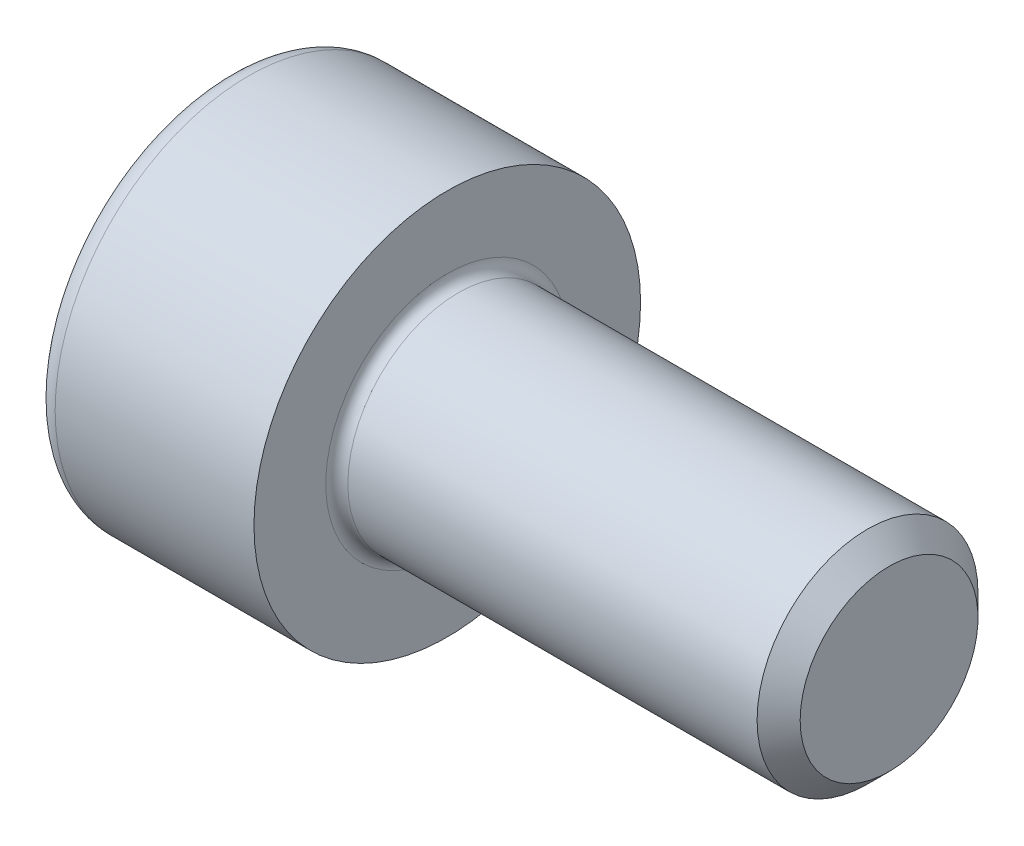
ISO-10303-21;
HEADER;
FILE_DESCRIPTION(('STEP AP214'),'2;1');
FILE_NAME('part.step','',(''),(''),'','','');
FILE_SCHEMA(('AUTOMOTIVE_DESIGN { 1 0 10303 214 1 1 1 1 }'));
ENDSEC;
DATA;
#1=APPLICATION_CONTEXT('core data for automotive mechanical design processes');
#2=APPLICATION_PROTOCOL_DEFINITION('international standard','automotive_design',2000,#1);
#3=PRODUCT_CONTEXT('',#1,'mechanical');
#4=PRODUCT('Part','Part','',(#3));
#5=PRODUCT_RELATED_PRODUCT_CATEGORY('part','',(#4));
#6=PRODUCT_DEFINITION_FORMATION('','',#4);
#7=PRODUCT_DEFINITION_CONTEXT('part definition',#1,'design');
#8=PRODUCT_DEFINITION('design','',#6,#7);
#9=PRODUCT_DEFINITION_SHAPE('','',#8);
#10=(LENGTH_UNIT() NAMED_UNIT(*) SI_UNIT(.MILLI.,.METRE.));
#11=(NAMED_UNIT(*) PLANE_ANGLE_UNIT() SI_UNIT($,.RADIAN.));
#12=(NAMED_UNIT(*) SI_UNIT($,.STERADIAN.) SOLID_ANGLE_UNIT());
#13=UNCERTAINTY_MEASURE_WITH_UNIT(LENGTH_MEASURE(1.E-05),#10,'distance_accuracy_value','');
#14=(GEOMETRIC_REPRESENTATION_CONTEXT(3) GLOBAL_UNCERTAINTY_ASSIGNED_CONTEXT((#13)) GLOBAL_UNIT_ASSIGNED_CONTEXT((#10,
#11,#12)) REPRESENTATION_CONTEXT('',''));
#15=CARTESIAN_POINT('',(0.,0.,0.));
#16=DIRECTION('',(0.,0.,1.));
#17=DIRECTION('',(1.,0.,0.));
#18=AXIS2_PLACEMENT_3D('',#15,#16,#17);
#19=CARTESIAN_POINT('',(0.,0.,0.));
#20=DIRECTION('',(-1.,0.,0.));
#21=DIRECTION('',(0.,0.,1.));
#22=AXIS2_PLACEMENT_3D('',#19,#20,#21);
#23=PLANE('',#22);
#24=DIRECTION('',(0.,-0.499999999999999,0.866025403784439));
#25=VECTOR('',#24,1.);
#26=CARTESIAN_POINT('',(0.,1.74359781295266,0.));
#27=LINE('',#26,#25);
#28=CARTESIAN_POINT('',(0.,1.74359781295266,0.));
#29=VERTEX_POINT('',#28);
#30=CARTESIAN_POINT('',(0.,0.871798906476331,1.51));
#31=VERTEX_POINT('',#30);
#32=EDGE_CURVE('E265',#29,#31,#27,.T.);
#33=ORIENTED_EDGE('',*,*,#32,.T.);
#34=DIRECTION('',(0.,1.,0.));
#35=VECTOR('',#34,1.);
#36=CARTESIAN_POINT('',(0.,-0.871798906476339,1.51));
#37=LINE('',#36,#35);
#38=CARTESIAN_POINT('',(0.,-0.871798906476339,1.51));
#39=VERTEX_POINT('',#38);
#40=EDGE_CURVE('E137',#39,#31,#37,.T.);
#41=ORIENTED_EDGE('',*,*,#40,.F.);
#42=DIRECTION('',(0.,-0.500000000000001,-0.866025403784438));
#43=VECTOR('',#42,1.);
#44=CARTESIAN_POINT('',(0.,-0.871798906476339,1.51));
#45=LINE('',#44,#43);
#46=CARTESIAN_POINT('',(0.,-1.74359781295268,0.));
#47=VERTEX_POINT('',#46);
#48=EDGE_CURVE('E268',#39,#47,#45,.T.);
#49=ORIENTED_EDGE('',*,*,#48,.T.);
#50=DIRECTION('',(0.,0.499999999999999,-0.866025403784439));
#51=VECTOR('',#50,1.);
#52=CARTESIAN_POINT('',(0.,-1.74359781295268,0.));
#53=LINE('',#52,#51);
#54=CARTESIAN_POINT('',(0.,-0.871798906476343,-1.51));
#55=VERTEX_POINT('',#54);
#56=EDGE_CURVE('E271',#47,#55,#53,.T.);
#57=ORIENTED_EDGE('',*,*,#56,.T.);
#58=DIRECTION('',(0.,-1.,0.));
#59=VECTOR('',#58,1.);
#60=CARTESIAN_POINT('',(0.,0.871798906476327,-1.51));
#61=LINE('',#60,#59);
#62=CARTESIAN_POINT('',(0.,0.871798906476327,-1.51));
#63=VERTEX_POINT('',#62);
#64=EDGE_CURVE('E274',#63,#55,#61,.T.);
#65=ORIENTED_EDGE('',*,*,#64,.F.);
#66=DIRECTION('',(0.,-0.500000000000001,-0.866025403784438));
#67=VECTOR('',#66,1.);
#68=CARTESIAN_POINT('',(0.,1.74359781295266,0.));
#69=LINE('',#68,#67);
#70=EDGE_CURVE('E132',#29,#63,#69,.T.);
#71=ORIENTED_EDGE('',*,*,#70,.F.);
#72=EDGE_LOOP('',(#33,#41,#49,#57,#65,#71));
#73=FACE_BOUND('',#72,.T.);
#74=CARTESIAN_POINT('',(0.,0.,0.));
#75=DIRECTION('',(-1.,0.,0.));
#76=DIRECTION('',(0.,0.,1.));
#77=AXIS2_PLACEMENT_3D('',#74,#75,#76);
#78=CIRCLE('',#77,3.1);
#79=CARTESIAN_POINT('',(0.,0.,3.1));
#80=VERTEX_POINT('',#79);
#81=EDGE_CURVE('E49',#80,#80,#78,.T.);
#82=ORIENTED_EDGE('',*,*,#81,.T.);
#83=EDGE_LOOP('',(#82));
#84=FACE_BOUND('',#83,.T.);
#85=ADVANCED_FACE('F41',(#73,#84),#23,.T.);
#86=CARTESIAN_POINT('',(-31.75,0.,0.));
#87=DIRECTION('',(-1.,0.,0.));
#88=DIRECTION('',(0.,0.,1.));
#89=AXIS2_PLACEMENT_3D('',#86,#87,#88);
#90=CYLINDRICAL_SURFACE('',#89,3.5);
#91=CARTESIAN_POINT('',(0.399999999999998,0.,0.));
#92=DIRECTION('',(-1.,0.,0.));
#93=DIRECTION('',(0.,0.,1.));
#94=AXIS2_PLACEMENT_3D('',#91,#92,#93);
#95=CIRCLE('',#94,3.5);
#96=CARTESIAN_POINT('',(0.399999999999998,0.,3.5));
#97=VERTEX_POINT('',#96);
#98=EDGE_CURVE('E11',#97,#97,#95,.F.);
#99=ORIENTED_EDGE('',*,*,#98,.T.);
#100=EDGE_LOOP('',(#99));
#101=FACE_BOUND('',#100,.T.);
#102=CARTESIAN_POINT('',(4.,0.,0.));
#103=DIRECTION('',(-1.,0.,0.));
#104=DIRECTION('',(0.,0.,1.));
#105=AXIS2_PLACEMENT_3D('',#102,#103,#104);
#106=CIRCLE('',#105,3.5);
#107=CARTESIAN_POINT('',(4.,0.,3.5));
#108=VERTEX_POINT('',#107);
#109=EDGE_CURVE('E155',#108,#108,#106,.T.);
#110=ORIENTED_EDGE('',*,*,#109,.T.);
#111=EDGE_LOOP('',(#110));
#112=FACE_BOUND('',#111,.T.);
#113=ADVANCED_FACE('F180',(#101,#112),#90,.T.);
#114=CARTESIAN_POINT('',(4.,3.5,0.));
#115=DIRECTION('',(1.,0.,0.));
#116=DIRECTION('',(0.,0.,-1.));
#117=AXIS2_PLACEMENT_3D('',#114,#115,#116);
#118=PLANE('',#117);
#119=CARTESIAN_POINT('',(4.,0.,0.));
#120=DIRECTION('',(1.,0.,0.));
#121=DIRECTION('',(0.,0.,-1.));
#122=AXIS2_PLACEMENT_3D('',#119,#120,#121);
#123=CIRCLE('',#122,2.19999999999981);
#124=CARTESIAN_POINT('',(4.,0.,-2.19999999999981));
#125=VERTEX_POINT('',#124);
#126=EDGE_CURVE('E158',#125,#125,#123,.F.);
#127=ORIENTED_EDGE('',*,*,#126,.T.);
#128=EDGE_LOOP('',(#127));
#129=FACE_BOUND('',#128,.T.);
#130=ORIENTED_EDGE('',*,*,#109,.F.);
#131=EDGE_LOOP('',(#130));
#132=FACE_BOUND('',#131,.T.);
#133=ADVANCED_FACE('F185',(#129,#132),#118,.T.);
#134=CARTESIAN_POINT('',(-31.75,0.,0.));
#135=DIRECTION('',(-1.,0.,0.));
#136=DIRECTION('',(0.,0.,1.));
#137=AXIS2_PLACEMENT_3D('',#134,#135,#136);
#138=CYLINDRICAL_SURFACE('',#137,1.99999999999981);
#139=CARTESIAN_POINT('',(4.2,0.,0.));
#140=DIRECTION('',(1.,0.,0.));
#141=DIRECTION('',(0.,0.,-1.));
#142=AXIS2_PLACEMENT_3D('',#139,#140,#141);
#143=CIRCLE('',#142,1.99999999999981);
#144=CARTESIAN_POINT('',(4.2,0.,-1.99999999999981));
#145=VERTEX_POINT('',#144);
#146=EDGE_CURVE('E161',#145,#145,#143,.T.);
#147=ORIENTED_EDGE('',*,*,#146,.T.);
#148=EDGE_LOOP('',(#147));
#149=FACE_BOUND('',#148,.T.);
#150=CARTESIAN_POINT('',(11.6099999999996,0.,0.));
#151=DIRECTION('',(-1.,0.,0.));
#152=DIRECTION('',(0.,0.,1.));
#153=AXIS2_PLACEMENT_3D('',#150,#151,#152);
#154=CIRCLE('',#153,1.99999999999963);
#155=CARTESIAN_POINT('',(11.6099999999996,0.,1.99999999999963));
#156=VERTEX_POINT('',#155);
#157=EDGE_CURVE('E152',#156,#156,#154,.T.);
#158=ORIENTED_EDGE('',*,*,#157,.T.);
#159=EDGE_LOOP('',(#158));
#160=FACE_BOUND('',#159,.T.);
#161=ADVANCED_FACE('F191',(#149,#160),#138,.T.);
#162=CARTESIAN_POINT('',(12.,0.,0.));
#163=DIRECTION('',(-1.,0.,0.));
#164=DIRECTION('',(0.,0.,1.));
#165=AXIS2_PLACEMENT_3D('',#162,#163,#164);
#166=CONICAL_SURFACE('',#165,1.61,0.785398163396504);
#167=ORIENTED_EDGE('',*,*,#157,.F.);
#168=EDGE_LOOP('',(#167));
#169=FACE_BOUND('',#168,.T.);
#170=CARTESIAN_POINT('',(12.,0.,0.));
#171=DIRECTION('',(-1.,0.,0.));
#172=DIRECTION('',(0.,0.,1.));
#173=AXIS2_PLACEMENT_3D('',#170,#171,#172);
#174=CIRCLE('',#173,1.61);
#175=CARTESIAN_POINT('',(12.,0.,1.61));
#176=VERTEX_POINT('',#175);
#177=EDGE_CURVE('E148',#176,#176,#174,.T.);
#178=ORIENTED_EDGE('',*,*,#177,.T.);
#179=EDGE_LOOP('',(#178));
#180=FACE_BOUND('',#179,.T.);
#181=ADVANCED_FACE('F195',(#169,#180),#166,.T.);
#182=CARTESIAN_POINT('',(12.,1.61,0.));
#183=DIRECTION('',(1.,0.,0.));
#184=DIRECTION('',(0.,0.,-1.));
#185=AXIS2_PLACEMENT_3D('',#182,#183,#184);
#186=PLANE('',#185);
#187=ORIENTED_EDGE('',*,*,#177,.F.);
#188=EDGE_LOOP('',(#187));
#189=FACE_BOUND('',#188,.T.);
#190=ADVANCED_FACE('F177',(#189),#186,.T.);
#191=CARTESIAN_POINT('',(4.2,0.,0.));
#192=DIRECTION('',(1.,0.,0.));
#193=DIRECTION('',(0.,0.,-1.));
#194=AXIS2_PLACEMENT_3D('',#191,#192,#193);
#195=TOROIDAL_SURFACE('',#194,2.19999999999981,0.2);
#196=ORIENTED_EDGE('',*,*,#146,.F.);
#197=EDGE_LOOP('',(#196));
#198=FACE_BOUND('',#197,.T.);
#199=ORIENTED_EDGE('',*,*,#126,.F.);
#200=EDGE_LOOP('',(#199));
#201=FACE_BOUND('',#200,.T.);
#202=ADVANCED_FACE('F168',(#198,#201),#195,.F.);
#203=CARTESIAN_POINT('',(0.399999999999998,0.,0.));
#204=DIRECTION('',(-1.,0.,0.));
#205=DIRECTION('',(0.,0.,1.));
#206=AXIS2_PLACEMENT_3D('',#203,#204,#205);
#207=TOROIDAL_SURFACE('',#206,3.1,0.4);
#208=ORIENTED_EDGE('',*,*,#98,.F.);
#209=EDGE_LOOP('',(#208));
#210=FACE_BOUND('',#209,.T.);
#211=ORIENTED_EDGE('',*,*,#81,.F.);
#212=EDGE_LOOP('',(#211));
#213=FACE_BOUND('',#212,.T.);
#214=ADVANCED_FACE('F43',(#210,#213),#207,.T.);
#215=CARTESIAN_POINT('',(2.,1.74359781295266,0.));
#216=DIRECTION('',(0.,-0.866025403784439,-0.499999999999999));
#217=DIRECTION('',(0.,0.499999999999999,-0.866025403784439));
#218=AXIS2_PLACEMENT_3D('',#215,#216,#217);
#219=PLANE('',#218);
#220=ORIENTED_EDGE('',*,*,#32,.F.);
#221=DIRECTION('',(-1.,0.,0.));
#222=VECTOR('',#221,1.);
#223=CARTESIAN_POINT('',(2.,1.74359781295266,0.));
#224=LINE('',#223,#222);
#225=CARTESIAN_POINT('',(2.,1.74359781295266,0.));
#226=VERTEX_POINT('',#225);
#227=EDGE_CURVE('E255',#226,#29,#224,.T.);
#228=ORIENTED_EDGE('',*,*,#227,.F.);
#229=DIRECTION('',(0.,-0.499999999999999,0.866025403784439));
#230=VECTOR('',#229,1.);
#231=CARTESIAN_POINT('',(2.,1.74359781295266,0.));
#232=LINE('',#231,#230);
#233=CARTESIAN_POINT('',(2.,1.3076983597145,0.754999999999996));
#234=VERTEX_POINT('',#233);
#235=EDGE_CURVE('E124',#226,#234,#232,.T.);
#236=ORIENTED_EDGE('',*,*,#235,.T.);
#237=CARTESIAN_POINT('',(2.,0.871798906476331,1.51));
#238=VERTEX_POINT('',#237);
#239=EDGE_CURVE('E115',#234,#238,#232,.T.);
#240=ORIENTED_EDGE('',*,*,#239,.T.);
#241=DIRECTION('',(-1.,0.,0.));
#242=VECTOR('',#241,1.);
#243=CARTESIAN_POINT('',(2.,0.871798906476331,1.51));
#244=LINE('',#243,#242);
#245=EDGE_CURVE('E129',#238,#31,#244,.T.);
#246=ORIENTED_EDGE('',*,*,#245,.T.);
#247=EDGE_LOOP('',(#220,#228,#236,#240,#246));
#248=FACE_BOUND('',#247,.T.);
#249=ADVANCED_FACE('F128',(#248),#219,.T.);
#250=CARTESIAN_POINT('',(2.,-0.871798906476339,1.51));
#251=DIRECTION('',(0.,0.,1.));
#252=DIRECTION('',(0.,-1.,0.));
#253=AXIS2_PLACEMENT_3D('',#250,#251,#252);
#254=PLANE('',#253);
#255=ORIENTED_EDGE('',*,*,#40,.T.);
#256=ORIENTED_EDGE('',*,*,#245,.F.);
#257=DIRECTION('',(0.,1.,0.));
#258=VECTOR('',#257,1.);
#259=CARTESIAN_POINT('',(2.,-0.871798906476339,1.51));
#260=LINE('',#259,#258);
#261=CARTESIAN_POINT('',(2.,0.,1.51));
#262=VERTEX_POINT('',#261);
#263=EDGE_CURVE('E112',#262,#238,#260,.T.);
#264=ORIENTED_EDGE('',*,*,#263,.F.);
#265=CARTESIAN_POINT('',(2.,-0.871798906476339,1.51));
#266=VERTEX_POINT('',#265);
#267=EDGE_CURVE('E123',#266,#262,#260,.T.);
#268=ORIENTED_EDGE('',*,*,#267,.F.);
#269=DIRECTION('',(-1.,0.,0.));
#270=VECTOR('',#269,1.);
#271=CARTESIAN_POINT('',(2.,-0.871798906476339,1.51));
#272=LINE('',#271,#270);
#273=EDGE_CURVE('E139',#266,#39,#272,.T.);
#274=ORIENTED_EDGE('',*,*,#273,.T.);
#275=EDGE_LOOP('',(#255,#256,#264,#268,#274));
#276=FACE_BOUND('',#275,.T.);
#277=ADVANCED_FACE('F134',(#276),#254,.F.);
#278=CARTESIAN_POINT('',(2.,-0.871798906476339,1.51));
#279=DIRECTION('',(0.,0.866025403784438,-0.500000000000001));
#280=DIRECTION('',(0.,0.500000000000001,0.866025403784438));
#281=AXIS2_PLACEMENT_3D('',#278,#279,#280);
#282=PLANE('',#281);
#283=ORIENTED_EDGE('',*,*,#48,.F.);
#284=ORIENTED_EDGE('',*,*,#273,.F.);
#285=DIRECTION('',(0.,-0.500000000000001,-0.866025403784438));
#286=VECTOR('',#285,1.);
#287=CARTESIAN_POINT('',(2.,-0.871798906476339,1.51));
#288=LINE('',#287,#286);
#289=CARTESIAN_POINT('',(2.,-1.3076983597145,0.755000000000003));
#290=VERTEX_POINT('',#289);
#291=EDGE_CURVE('E294',#266,#290,#288,.T.);
#292=ORIENTED_EDGE('',*,*,#291,.T.);
#293=CARTESIAN_POINT('',(2.,-1.74359781295268,0.));
#294=VERTEX_POINT('',#293);
#295=EDGE_CURVE('E283',#290,#294,#288,.T.);
#296=ORIENTED_EDGE('',*,*,#295,.T.);
#297=DIRECTION('',(-1.,0.,0.));
#298=VECTOR('',#297,1.);
#299=CARTESIAN_POINT('',(2.,-1.74359781295268,0.));
#300=LINE('',#299,#298);
#301=EDGE_CURVE('E144',#294,#47,#300,.T.);
#302=ORIENTED_EDGE('',*,*,#301,.T.);
#303=EDGE_LOOP('',(#283,#284,#292,#296,#302));
#304=FACE_BOUND('',#303,.T.);
#305=ADVANCED_FACE('F209',(#304),#282,.T.);
#306=CARTESIAN_POINT('',(2.,-1.74359781295268,0.));
#307=DIRECTION('',(0.,0.866025403784439,0.499999999999999));
#308=DIRECTION('',(0.,-0.499999999999999,0.866025403784439));
#309=AXIS2_PLACEMENT_3D('',#306,#307,#308);
#310=PLANE('',#309);
#311=ORIENTED_EDGE('',*,*,#56,.F.);
#312=ORIENTED_EDGE('',*,*,#301,.F.);
#313=DIRECTION('',(0.,0.499999999999999,-0.866025403784439));
#314=VECTOR('',#313,1.);
#315=CARTESIAN_POINT('',(2.,-1.74359781295268,0.));
#316=LINE('',#315,#314);
#317=CARTESIAN_POINT('',(2.,-1.30769835971451,-0.755000000000002));
#318=VERTEX_POINT('',#317);
#319=EDGE_CURVE('E261',#294,#318,#316,.T.);
#320=ORIENTED_EDGE('',*,*,#319,.T.);
#321=CARTESIAN_POINT('',(2.,-0.871798906476343,-1.51));
#322=VERTEX_POINT('',#321);
#323=EDGE_CURVE('E293',#318,#322,#316,.T.);
#324=ORIENTED_EDGE('',*,*,#323,.T.);
#325=DIRECTION('',(-1.,0.,0.));
#326=VECTOR('',#325,1.);
#327=CARTESIAN_POINT('',(2.,-0.871798906476343,-1.51));
#328=LINE('',#327,#326);
#329=EDGE_CURVE('E254',#322,#55,#328,.T.);
#330=ORIENTED_EDGE('',*,*,#329,.T.);
#331=EDGE_LOOP('',(#311,#312,#320,#324,#330));
#332=FACE_BOUND('',#331,.T.);
#333=ADVANCED_FACE('F212',(#332),#310,.T.);
#334=CARTESIAN_POINT('',(2.,0.871798906476327,-1.51));
#335=DIRECTION('',(0.,0.,-1.));
#336=DIRECTION('',(0.,1.,0.));
#337=AXIS2_PLACEMENT_3D('',#334,#335,#336);
#338=PLANE('',#337);
#339=ORIENTED_EDGE('',*,*,#64,.T.);
#340=ORIENTED_EDGE('',*,*,#329,.F.);
#341=DIRECTION('',(0.,-1.,0.));
#342=VECTOR('',#341,1.);
#343=CARTESIAN_POINT('',(2.,0.871798906476327,-1.51));
#344=LINE('',#343,#342);
#345=CARTESIAN_POINT('',(2.,0.,-1.51));
#346=VERTEX_POINT('',#345);
#347=EDGE_CURVE('E258',#346,#322,#344,.T.);
#348=ORIENTED_EDGE('',*,*,#347,.F.);
#349=CARTESIAN_POINT('',(2.,0.871798906476327,-1.51));
#350=VERTEX_POINT('',#349);
#351=EDGE_CURVE('E56',#350,#346,#344,.T.);
#352=ORIENTED_EDGE('',*,*,#351,.F.);
#353=DIRECTION('',(-1.,0.,0.));
#354=VECTOR('',#353,1.);
#355=CARTESIAN_POINT('',(2.,0.871798906476327,-1.51));
#356=LINE('',#355,#354);
#357=EDGE_CURVE('E251',#350,#63,#356,.T.);
#358=ORIENTED_EDGE('',*,*,#357,.T.);
#359=EDGE_LOOP('',(#339,#340,#348,#352,#358));
#360=FACE_BOUND('',#359,.T.);
#361=ADVANCED_FACE('F216',(#360),#338,.F.);
#362=CARTESIAN_POINT('',(2.,1.74359781295266,0.));
#363=DIRECTION('',(0.,0.866025403784438,-0.500000000000001));
#364=DIRECTION('',(0.,0.500000000000001,0.866025403784438));
#365=AXIS2_PLACEMENT_3D('',#362,#363,#364);
#366=PLANE('',#365);
#367=ORIENTED_EDGE('',*,*,#70,.T.);
#368=ORIENTED_EDGE('',*,*,#357,.F.);
#369=DIRECTION('',(0.,-0.500000000000001,-0.866025403784438));
#370=VECTOR('',#369,1.);
#371=CARTESIAN_POINT('',(2.,1.74359781295266,0.));
#372=LINE('',#371,#370);
#373=CARTESIAN_POINT('',(2.,1.3076983597145,-0.755));
#374=VERTEX_POINT('',#373);
#375=EDGE_CURVE('E241',#374,#350,#372,.T.);
#376=ORIENTED_EDGE('',*,*,#375,.F.);
#377=EDGE_CURVE('E247',#226,#374,#372,.T.);
#378=ORIENTED_EDGE('',*,*,#377,.F.);
#379=ORIENTED_EDGE('',*,*,#227,.T.);
#380=EDGE_LOOP('',(#367,#368,#376,#378,#379));
#381=FACE_BOUND('',#380,.T.);
#382=ADVANCED_FACE('F220',(#381),#366,.F.);
#383=CARTESIAN_POINT('',(2.,1.74359781295266,0.));
#384=DIRECTION('',(1.,0.,0.));
#385=DIRECTION('',(0.,0.,-1.));
#386=AXIS2_PLACEMENT_3D('',#383,#384,#385);
#387=PLANE('',#386);
#388=ORIENTED_EDGE('',*,*,#347,.T.);
#389=ORIENTED_EDGE('',*,*,#323,.F.);
#390=CARTESIAN_POINT('',(2.,0.,0.));
#391=DIRECTION('',(-1.,0.,0.));
#392=DIRECTION('',(0.,0.,1.));
#393=AXIS2_PLACEMENT_3D('',#390,#391,#392);
#394=CIRCLE('',#393,1.51);
#395=EDGE_CURVE('E289',#346,#318,#394,.T.);
#396=ORIENTED_EDGE('',*,*,#395,.F.);
#397=EDGE_LOOP('',(#388,#389,#396));
#398=FACE_BOUND('',#397,.T.);
#399=ADVANCED_FACE('F224',(#398),#387,.F.);
#400=ORIENTED_EDGE('',*,*,#319,.F.);
#401=ORIENTED_EDGE('',*,*,#295,.F.);
#402=EDGE_CURVE('E142',#318,#290,#394,.T.);
#403=ORIENTED_EDGE('',*,*,#402,.F.);
#404=EDGE_LOOP('',(#400,#401,#403));
#405=FACE_BOUND('',#404,.T.);
#406=ADVANCED_FACE('F227',(#405),#387,.F.);
#407=ORIENTED_EDGE('',*,*,#291,.F.);
#408=ORIENTED_EDGE('',*,*,#267,.T.);
#409=EDGE_CURVE('E138',#290,#262,#394,.T.);
#410=ORIENTED_EDGE('',*,*,#409,.F.);
#411=EDGE_LOOP('',(#407,#408,#410));
#412=FACE_BOUND('',#411,.T.);
#413=ADVANCED_FACE('F232',(#412),#387,.F.);
#414=ORIENTED_EDGE('',*,*,#263,.T.);
#415=ORIENTED_EDGE('',*,*,#239,.F.);
#416=EDGE_CURVE('E118',#262,#234,#394,.T.);
#417=ORIENTED_EDGE('',*,*,#416,.F.);
#418=EDGE_LOOP('',(#414,#415,#417));
#419=FACE_BOUND('',#418,.T.);
#420=ADVANCED_FACE('F114',(#419),#387,.F.);
#421=ORIENTED_EDGE('',*,*,#235,.F.);
#422=ORIENTED_EDGE('',*,*,#377,.T.);
#423=EDGE_CURVE('E149',#234,#374,#394,.T.);
#424=ORIENTED_EDGE('',*,*,#423,.F.);
#425=EDGE_LOOP('',(#421,#422,#424));
#426=FACE_BOUND('',#425,.T.);
#427=ADVANCED_FACE('F235',(#426),#387,.F.);
#428=ORIENTED_EDGE('',*,*,#375,.T.);
#429=ORIENTED_EDGE('',*,*,#351,.T.);
#430=EDGE_CURVE('E244',#374,#346,#394,.T.);
#431=ORIENTED_EDGE('',*,*,#430,.F.);
#432=EDGE_LOOP('',(#428,#429,#431));
#433=FACE_BOUND('',#432,.T.);
#434=ADVANCED_FACE('F205',(#433),#387,.F.);
#435=CARTESIAN_POINT('',(2.,0.,0.));
#436=DIRECTION('',(-1.,0.,0.));
#437=DIRECTION('',(0.,0.,1.));
#438=AXIS2_PLACEMENT_3D('',#435,#436,#437);
#439=CONICAL_SURFACE('',#438,1.51,1.04719755119659);
#440=CARTESIAN_POINT('',(2.87179890647635,0.,0.));
#441=VERTEX_POINT('',#440);
#442=VERTEX_LOOP('',#441);
#443=FACE_BOUND('',#442,.T.);
#444=ORIENTED_EDGE('',*,*,#416,.T.);
#445=ORIENTED_EDGE('',*,*,#423,.T.);
#446=ORIENTED_EDGE('',*,*,#430,.T.);
#447=ORIENTED_EDGE('',*,*,#395,.T.);
#448=ORIENTED_EDGE('',*,*,#402,.T.);
#449=ORIENTED_EDGE('',*,*,#409,.T.);
#450=EDGE_LOOP('',(#444,#445,#446,#447,#448,#449));
#451=FACE_BOUND('',#450,.T.);
#452=ADVANCED_FACE('F203',(#443,#451),#439,.F.);
#453=CLOSED_SHELL('',(#85,#113,#133,#161,#181,#190,#202,#214,#249,#277,#305,#333,#361,#382,#399,
#406,#413,#420,#427,#434,#452));
#454=MANIFOLD_SOLID_BREP('B2',#453);
#455=ADVANCED_BREP_SHAPE_REPRESENTATION('',(#18,#454),#14);
#456=SHAPE_DEFINITION_REPRESENTATION(#9,#455);
ENDSEC;
END-ISO-10303-21;
